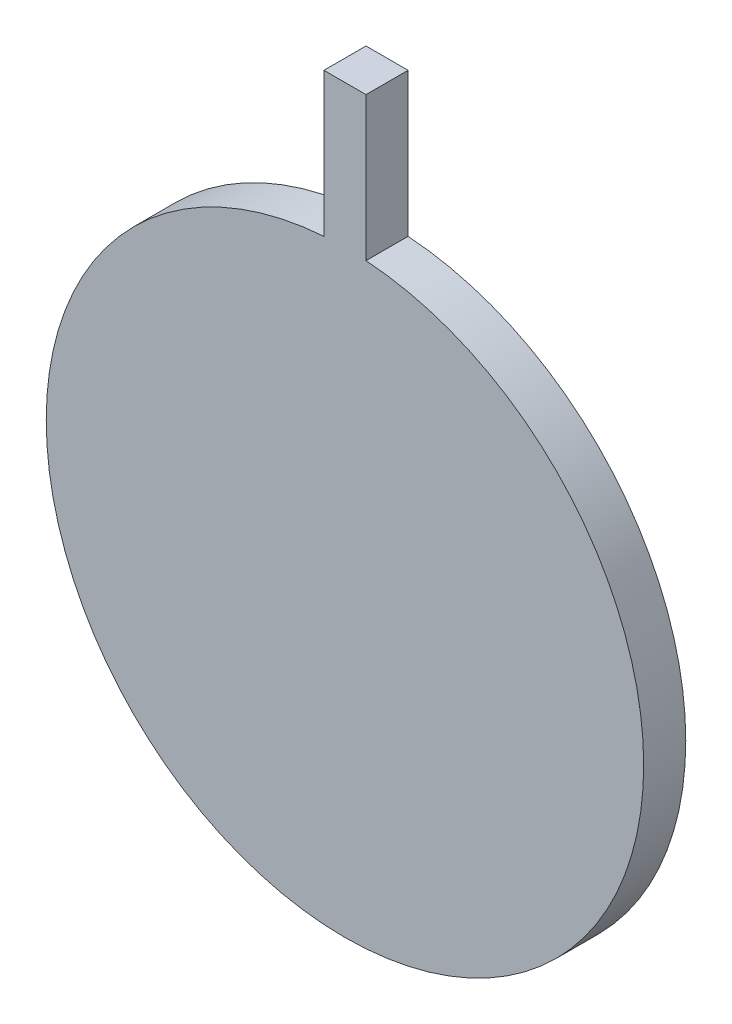
ISO-10303-21;
HEADER;
FILE_DESCRIPTION(('STEP AP214'),'2;1');
FILE_NAME('part.step','',(''),(''),'','','');
FILE_SCHEMA(('AUTOMOTIVE_DESIGN { 1 0 10303 214 1 1 1 1 }'));
ENDSEC;
DATA;
#1=APPLICATION_CONTEXT('core data for automotive mechanical design processes');
#2=APPLICATION_PROTOCOL_DEFINITION('international standard','automotive_design',2000,#1);
#3=PRODUCT_CONTEXT('',#1,'mechanical');
#4=PRODUCT('Part','Part','',(#3));
#5=PRODUCT_RELATED_PRODUCT_CATEGORY('part','',(#4));
#6=PRODUCT_DEFINITION_FORMATION('','',#4);
#7=PRODUCT_DEFINITION_CONTEXT('part definition',#1,'design');
#8=PRODUCT_DEFINITION('design','',#6,#7);
#9=PRODUCT_DEFINITION_SHAPE('','',#8);
#10=(LENGTH_UNIT() NAMED_UNIT(*) SI_UNIT(.MILLI.,.METRE.));
#11=(NAMED_UNIT(*) PLANE_ANGLE_UNIT() SI_UNIT($,.RADIAN.));
#12=(NAMED_UNIT(*) SI_UNIT($,.STERADIAN.) SOLID_ANGLE_UNIT());
#13=UNCERTAINTY_MEASURE_WITH_UNIT(LENGTH_MEASURE(1.E-05),#10,'distance_accuracy_value','');
#14=(GEOMETRIC_REPRESENTATION_CONTEXT(3) GLOBAL_UNCERTAINTY_ASSIGNED_CONTEXT((#13)) GLOBAL_UNIT_ASSIGNED_CONTEXT((#10,
#11,#12)) REPRESENTATION_CONTEXT('',''));
#15=CARTESIAN_POINT('',(0.,0.,0.));
#16=DIRECTION('',(0.,0.,1.));
#17=DIRECTION('',(1.,0.,0.));
#18=AXIS2_PLACEMENT_3D('',#15,#16,#17);
#19=CARTESIAN_POINT('',(0.,0.,2.54));
#20=DIRECTION('',(0.,0.,-1.));
#21=DIRECTION('',(-1.,0.,0.));
#22=AXIS2_PLACEMENT_3D('',#19,#20,#21);
#23=CYLINDRICAL_SURFACE('',#22,18.034);
#24=DIRECTION('',(0.,0.,-1.));
#25=VECTOR('',#24,1.);
#26=CARTESIAN_POINT('',(-1.27,17.9892261089798,2.54));
#27=LINE('',#26,#25);
#28=CARTESIAN_POINT('',(-1.27,17.9892261089798,0.));
#29=VERTEX_POINT('',#28);
#30=CARTESIAN_POINT('',(-1.27,17.9892261089798,2.54));
#31=VERTEX_POINT('',#30);
#32=EDGE_CURVE('E92',#29,#31,#27,.F.);
#33=ORIENTED_EDGE('',*,*,#32,.F.);
#34=CARTESIAN_POINT('',(0.,0.,0.));
#35=DIRECTION('',(0.,0.,1.));
#36=DIRECTION('',(1.,0.,0.));
#37=AXIS2_PLACEMENT_3D('',#34,#35,#36);
#38=CIRCLE('',#37,18.034);
#39=CARTESIAN_POINT('',(1.27,17.9892261089798,0.));
#40=VERTEX_POINT('',#39);
#41=EDGE_CURVE('E38',#29,#40,#38,.T.);
#42=ORIENTED_EDGE('',*,*,#41,.T.);
#43=DIRECTION('',(0.,0.,-1.));
#44=VECTOR('',#43,1.);
#45=CARTESIAN_POINT('',(1.27,17.9892261089798,2.54));
#46=LINE('',#45,#44);
#47=CARTESIAN_POINT('',(1.27,17.9892261089798,2.54));
#48=VERTEX_POINT('',#47);
#49=EDGE_CURVE('E52',#48,#40,#46,.T.);
#50=ORIENTED_EDGE('',*,*,#49,.F.);
#51=CARTESIAN_POINT('',(0.,0.,2.54));
#52=DIRECTION('',(0.,0.,1.));
#53=DIRECTION('',(1.,0.,0.));
#54=AXIS2_PLACEMENT_3D('',#51,#52,#53);
#55=CIRCLE('',#54,18.034);
#56=EDGE_CURVE('E11',#31,#48,#55,.T.);
#57=ORIENTED_EDGE('',*,*,#56,.F.);
#58=EDGE_LOOP('',(#33,#42,#50,#57));
#59=FACE_BOUND('',#58,.T.);
#60=ADVANCED_FACE('F35',(#59),#23,.T.);
#61=CARTESIAN_POINT('',(0.,0.,2.54));
#62=DIRECTION('',(0.,0.,1.));
#63=DIRECTION('',(1.,0.,0.));
#64=AXIS2_PLACEMENT_3D('',#61,#62,#63);
#65=PLANE('',#64);
#66=ORIENTED_EDGE('',*,*,#56,.T.);
#67=DIRECTION('',(0.,-1.,0.));
#68=VECTOR('',#67,1.);
#69=CARTESIAN_POINT('',(1.27,26.67,2.54));
#70=LINE('',#69,#68);
#71=CARTESIAN_POINT('',(1.27,26.67,2.54));
#72=VERTEX_POINT('',#71);
#73=EDGE_CURVE('E77',#72,#48,#70,.T.);
#74=ORIENTED_EDGE('',*,*,#73,.F.);
#75=DIRECTION('',(1.,0.,0.));
#76=VECTOR('',#75,1.);
#77=CARTESIAN_POINT('',(1.27,26.67,2.54));
#78=LINE('',#77,#76);
#79=CARTESIAN_POINT('',(-1.27,26.67,2.54));
#80=VERTEX_POINT('',#79);
#81=EDGE_CURVE('E71',#80,#72,#78,.T.);
#82=ORIENTED_EDGE('',*,*,#81,.F.);
#83=DIRECTION('',(0.,-1.,0.));
#84=VECTOR('',#83,1.);
#85=CARTESIAN_POINT('',(-1.27,26.67,2.54));
#86=LINE('',#85,#84);
#87=EDGE_CURVE('E75',#80,#31,#86,.T.);
#88=ORIENTED_EDGE('',*,*,#87,.T.);
#89=EDGE_LOOP('',(#66,#74,#82,#88));
#90=FACE_BOUND('',#89,.T.);
#91=ADVANCED_FACE('F73',(#90),#65,.T.);
#92=CARTESIAN_POINT('',(0.,0.,0.));
#93=DIRECTION('',(0.,0.,1.));
#94=DIRECTION('',(1.,0.,0.));
#95=AXIS2_PLACEMENT_3D('',#92,#93,#94);
#96=PLANE('',#95);
#97=ORIENTED_EDGE('',*,*,#41,.F.);
#98=DIRECTION('',(0.,-1.,0.));
#99=VECTOR('',#98,1.);
#100=CARTESIAN_POINT('',(-1.27,26.67,0.));
#101=LINE('',#100,#99);
#102=CARTESIAN_POINT('',(-1.27,26.67,0.));
#103=VERTEX_POINT('',#102);
#104=EDGE_CURVE('E106',#103,#29,#101,.T.);
#105=ORIENTED_EDGE('',*,*,#104,.F.);
#106=DIRECTION('',(-1.,0.,0.));
#107=VECTOR('',#106,1.);
#108=CARTESIAN_POINT('',(1.27,26.67,0.));
#109=LINE('',#108,#107);
#110=CARTESIAN_POINT('',(1.27,26.67,0.));
#111=VERTEX_POINT('',#110);
#112=EDGE_CURVE('E86',#111,#103,#109,.T.);
#113=ORIENTED_EDGE('',*,*,#112,.F.);
#114=DIRECTION('',(0.,-1.,0.));
#115=VECTOR('',#114,1.);
#116=CARTESIAN_POINT('',(1.27,26.67,0.));
#117=LINE('',#116,#115);
#118=EDGE_CURVE('E95',#111,#40,#117,.T.);
#119=ORIENTED_EDGE('',*,*,#118,.T.);
#120=EDGE_LOOP('',(#97,#105,#113,#119));
#121=FACE_BOUND('',#120,.T.);
#122=ADVANCED_FACE('F105',(#121),#96,.F.);
#123=CARTESIAN_POINT('',(-1.27,26.67,2.54));
#124=DIRECTION('',(1.,0.,0.));
#125=DIRECTION('',(0.,0.,-1.));
#126=AXIS2_PLACEMENT_3D('',#123,#124,#125);
#127=PLANE('',#126);
#128=ORIENTED_EDGE('',*,*,#104,.T.);
#129=ORIENTED_EDGE('',*,*,#32,.T.);
#130=ORIENTED_EDGE('',*,*,#87,.F.);
#131=DIRECTION('',(0.,0.,1.));
#132=VECTOR('',#131,1.);
#133=CARTESIAN_POINT('',(-1.27,26.67,2.54));
#134=LINE('',#133,#132);
#135=EDGE_CURVE('E81',#103,#80,#134,.T.);
#136=ORIENTED_EDGE('',*,*,#135,.F.);
#137=EDGE_LOOP('',(#128,#129,#130,#136));
#138=FACE_BOUND('',#137,.T.);
#139=ADVANCED_FACE('F91',(#138),#127,.F.);
#140=CARTESIAN_POINT('',(1.27,26.67,2.54));
#141=DIRECTION('',(-1.,0.,0.));
#142=DIRECTION('',(0.,0.,1.));
#143=AXIS2_PLACEMENT_3D('',#140,#141,#142);
#144=PLANE('',#143);
#145=ORIENTED_EDGE('',*,*,#73,.T.);
#146=ORIENTED_EDGE('',*,*,#49,.T.);
#147=ORIENTED_EDGE('',*,*,#118,.F.);
#148=DIRECTION('',(0.,0.,-1.));
#149=VECTOR('',#148,1.);
#150=CARTESIAN_POINT('',(1.27,26.67,2.54));
#151=LINE('',#150,#149);
#152=EDGE_CURVE('E80',#72,#111,#151,.T.);
#153=ORIENTED_EDGE('',*,*,#152,.F.);
#154=EDGE_LOOP('',(#145,#146,#147,#153));
#155=FACE_BOUND('',#154,.T.);
#156=ADVANCED_FACE('F104',(#155),#144,.F.);
#157=CARTESIAN_POINT('',(0.,26.67,0.));
#158=DIRECTION('',(0.,1.,0.));
#159=DIRECTION('',(0.,0.,1.));
#160=AXIS2_PLACEMENT_3D('',#157,#158,#159);
#161=PLANE('',#160);
#162=ORIENTED_EDGE('',*,*,#135,.T.);
#163=ORIENTED_EDGE('',*,*,#81,.T.);
#164=ORIENTED_EDGE('',*,*,#152,.T.);
#165=ORIENTED_EDGE('',*,*,#112,.T.);
#166=EDGE_LOOP('',(#162,#163,#164,#165));
#167=FACE_BOUND('',#166,.T.);
#168=ADVANCED_FACE('F84',(#167),#161,.T.);
#169=CLOSED_SHELL('',(#60,#91,#122,#139,#156,#168));
#170=MANIFOLD_SOLID_BREP('B2',#169);
#171=ADVANCED_BREP_SHAPE_REPRESENTATION('',(#18,#170),#14);
#172=SHAPE_DEFINITION_REPRESENTATION(#9,#171);
ENDSEC;
END-ISO-10303-21;
